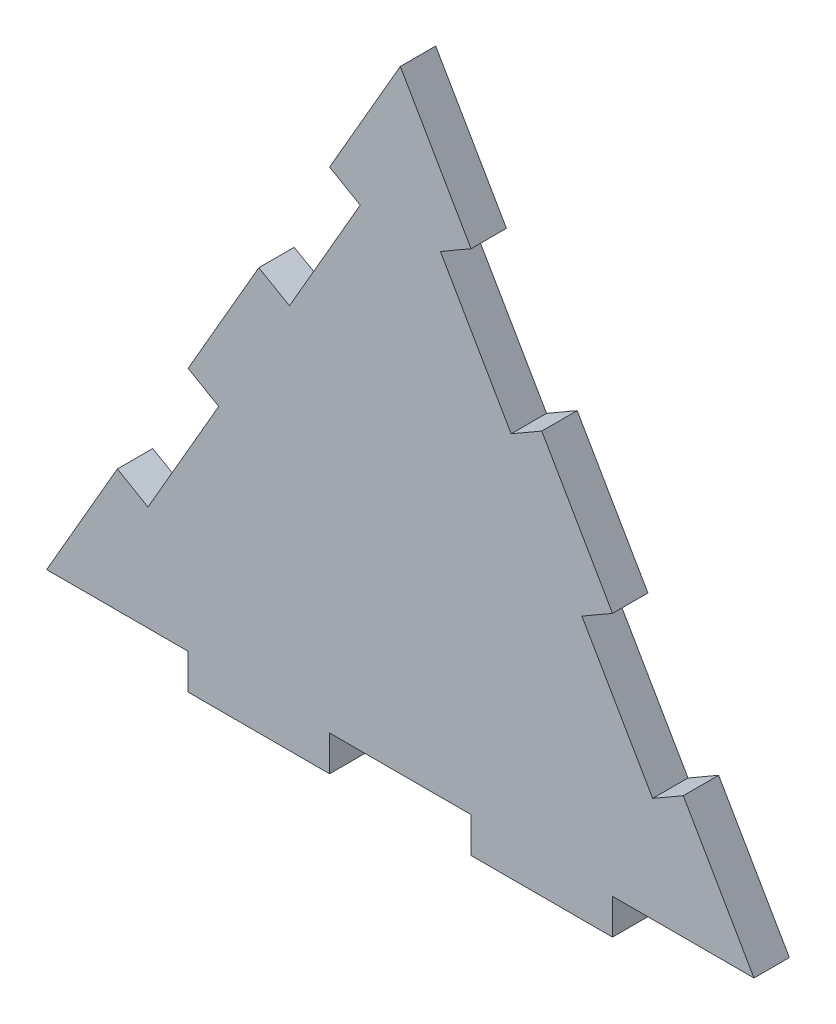
ISO-10303-21;
HEADER;
FILE_DESCRIPTION(('STEP AP214'),'2;1');
FILE_NAME('part.step','',(''),(''),'','','');
FILE_SCHEMA(('AUTOMOTIVE_DESIGN { 1 0 10303 214 1 1 1 1 }'));
ENDSEC;
DATA;
#1=APPLICATION_CONTEXT('core data for automotive mechanical design processes');
#2=APPLICATION_PROTOCOL_DEFINITION('international standard','automotive_design',2000,#1);
#3=PRODUCT_CONTEXT('',#1,'mechanical');
#4=PRODUCT('Part','Part','',(#3));
#5=PRODUCT_RELATED_PRODUCT_CATEGORY('part','',(#4));
#6=PRODUCT_DEFINITION_FORMATION('','',#4);
#7=PRODUCT_DEFINITION_CONTEXT('part definition',#1,'design');
#8=PRODUCT_DEFINITION('design','',#6,#7);
#9=PRODUCT_DEFINITION_SHAPE('','',#8);
#10=(LENGTH_UNIT() NAMED_UNIT(*) SI_UNIT(.MILLI.,.METRE.));
#11=(NAMED_UNIT(*) PLANE_ANGLE_UNIT() SI_UNIT($,.RADIAN.));
#12=(NAMED_UNIT(*) SI_UNIT($,.STERADIAN.) SOLID_ANGLE_UNIT());
#13=UNCERTAINTY_MEASURE_WITH_UNIT(LENGTH_MEASURE(1.E-05),#10,'distance_accuracy_value','');
#14=(GEOMETRIC_REPRESENTATION_CONTEXT(3) GLOBAL_UNCERTAINTY_ASSIGNED_CONTEXT((#13)) GLOBAL_UNIT_ASSIGNED_CONTEXT((#10,
#11,#12)) REPRESENTATION_CONTEXT('',''));
#15=CARTESIAN_POINT('',(0.,0.,0.));
#16=DIRECTION('',(0.,0.,1.));
#17=DIRECTION('',(1.,0.,0.));
#18=AXIS2_PLACEMENT_3D('',#15,#16,#17);
#19=CARTESIAN_POINT('',(-50.,86.6025403784439,5.));
#20=DIRECTION('',(-0.866025403784439,-0.5,0.));
#21=DIRECTION('',(0.5,-0.866025403784439,0.));
#22=AXIS2_PLACEMENT_3D('',#19,#20,#21);
#23=PLANE('',#22);
#24=DIRECTION('',(-0.5,0.866025403784438,0.));
#25=VECTOR('',#24,1.);
#26=CARTESIAN_POINT('',(-50.,86.6025403784439,0.));
#27=LINE('',#26,#25);
#28=CARTESIAN_POINT('',(-20.0000000000001,34.6410161513777,0.));
#29=VERTEX_POINT('',#28);
#30=CARTESIAN_POINT('',(-30.0000000000001,51.9615242270665,0.));
#31=VERTEX_POINT('',#30);
#32=EDGE_CURVE('E247',#29,#31,#27,.T.);
#33=ORIENTED_EDGE('',*,*,#32,.T.);
#34=DIRECTION('',(0.,0.,1.));
#35=VECTOR('',#34,1.);
#36=CARTESIAN_POINT('',(-30.0000000000001,51.9615242270665,0.));
#37=LINE('',#36,#35);
#38=CARTESIAN_POINT('',(-30.0000000000001,51.9615242270665,5.));
#39=VERTEX_POINT('',#38);
#40=EDGE_CURVE('E366',#31,#39,#37,.T.);
#41=ORIENTED_EDGE('',*,*,#40,.T.);
#42=DIRECTION('',(-0.5,0.866025403784438,0.));
#43=VECTOR('',#42,1.);
#44=CARTESIAN_POINT('',(-50.,86.6025403784439,5.));
#45=LINE('',#44,#43);
#46=CARTESIAN_POINT('',(-20.0000000000001,34.6410161513777,5.));
#47=VERTEX_POINT('',#46);
#48=EDGE_CURVE('E266',#47,#39,#45,.T.);
#49=ORIENTED_EDGE('',*,*,#48,.F.);
#50=DIRECTION('',(0.,0.,1.));
#51=VECTOR('',#50,1.);
#52=CARTESIAN_POINT('',(-20.0000000000001,34.6410161513777,0.));
#53=LINE('',#52,#51);
#54=EDGE_CURVE('E351',#29,#47,#53,.T.);
#55=ORIENTED_EDGE('',*,*,#54,.F.);
#56=EDGE_LOOP('',(#33,#41,#49,#55));
#57=FACE_BOUND('',#56,.T.);
#58=ADVANCED_FACE('F35',(#57),#23,.F.);
#59=CARTESIAN_POINT('',(0.,0.,0.));
#60=VERTEX_POINT('',#59);
#61=CARTESIAN_POINT('',(-10.0000000000001,17.3205080756889,0.));
#62=VERTEX_POINT('',#61);
#63=EDGE_CURVE('E242',#60,#62,#27,.T.);
#64=ORIENTED_EDGE('',*,*,#63,.T.);
#65=DIRECTION('',(0.,0.,1.));
#66=VECTOR('',#65,1.);
#67=CARTESIAN_POINT('',(-10.0000000000001,17.3205080756889,0.));
#68=LINE('',#67,#66);
#69=CARTESIAN_POINT('',(-10.0000000000001,17.3205080756889,5.));
#70=VERTEX_POINT('',#69);
#71=EDGE_CURVE('E349',#62,#70,#68,.T.);
#72=ORIENTED_EDGE('',*,*,#71,.T.);
#73=CARTESIAN_POINT('',(0.,0.,5.));
#74=VERTEX_POINT('',#73);
#75=EDGE_CURVE('E268',#74,#70,#45,.T.);
#76=ORIENTED_EDGE('',*,*,#75,.F.);
#77=DIRECTION('',(0.,0.,-1.));
#78=VECTOR('',#77,1.);
#79=CARTESIAN_POINT('',(0.,0.,5.));
#80=LINE('',#79,#78);
#81=EDGE_CURVE('E291',#74,#60,#80,.T.);
#82=ORIENTED_EDGE('',*,*,#81,.T.);
#83=EDGE_LOOP('',(#64,#72,#76,#82));
#84=FACE_BOUND('',#83,.T.);
#85=ADVANCED_FACE('F348',(#84),#23,.F.);
#86=CARTESIAN_POINT('',(-100.,0.,5.));
#87=DIRECTION('',(0.866025403784439,-0.5,0.));
#88=DIRECTION('',(0.5,0.866025403784439,0.));
#89=AXIS2_PLACEMENT_3D('',#86,#87,#88);
#90=PLANE('',#89);
#91=DIRECTION('',(-0.5,-0.866025403784439,0.));
#92=VECTOR('',#91,1.);
#93=CARTESIAN_POINT('',(-100.,0.,0.));
#94=LINE('',#93,#92);
#95=CARTESIAN_POINT('',(-70.,51.9615242270664,0.));
#96=VERTEX_POINT('',#95);
#97=CARTESIAN_POINT('',(-80.,34.6410161513777,0.));
#98=VERTEX_POINT('',#97);
#99=EDGE_CURVE('E241',#96,#98,#94,.T.);
#100=ORIENTED_EDGE('',*,*,#99,.T.);
#101=DIRECTION('',(0.,0.,1.));
#102=VECTOR('',#101,1.);
#103=CARTESIAN_POINT('',(-80.,34.6410161513777,0.));
#104=LINE('',#103,#102);
#105=CARTESIAN_POINT('',(-80.,34.6410161513777,5.));
#106=VERTEX_POINT('',#105);
#107=EDGE_CURVE('E398',#98,#106,#104,.T.);
#108=ORIENTED_EDGE('',*,*,#107,.T.);
#109=DIRECTION('',(-0.5,-0.866025403784439,0.));
#110=VECTOR('',#109,1.);
#111=CARTESIAN_POINT('',(-100.,0.,5.));
#112=LINE('',#111,#110);
#113=CARTESIAN_POINT('',(-70.,51.9615242270664,5.));
#114=VERTEX_POINT('',#113);
#115=EDGE_CURVE('E280',#114,#106,#112,.T.);
#116=ORIENTED_EDGE('',*,*,#115,.F.);
#117=DIRECTION('',(0.,0.,1.));
#118=VECTOR('',#117,1.);
#119=CARTESIAN_POINT('',(-70.,51.9615242270664,0.));
#120=LINE('',#119,#118);
#121=EDGE_CURVE('E393',#96,#114,#120,.T.);
#122=ORIENTED_EDGE('',*,*,#121,.F.);
#123=EDGE_LOOP('',(#100,#108,#116,#122));
#124=FACE_BOUND('',#123,.T.);
#125=ADVANCED_FACE('F447',(#124),#90,.F.);
#126=CARTESIAN_POINT('',(-50.,86.6025403784439,0.));
#127=VERTEX_POINT('',#126);
#128=CARTESIAN_POINT('',(-60.,69.2820323027552,0.));
#129=VERTEX_POINT('',#128);
#130=EDGE_CURVE('E244',#127,#129,#94,.T.);
#131=ORIENTED_EDGE('',*,*,#130,.T.);
#132=DIRECTION('',(0.,0.,1.));
#133=VECTOR('',#132,1.);
#134=CARTESIAN_POINT('',(-60.,69.2820323027552,0.));
#135=LINE('',#134,#133);
#136=CARTESIAN_POINT('',(-60.,69.2820323027552,5.));
#137=VERTEX_POINT('',#136);
#138=EDGE_CURVE('E402',#129,#137,#135,.T.);
#139=ORIENTED_EDGE('',*,*,#138,.T.);
#140=CARTESIAN_POINT('',(-50.,86.6025403784439,5.));
#141=VERTEX_POINT('',#140);
#142=EDGE_CURVE('E281',#141,#137,#112,.T.);
#143=ORIENTED_EDGE('',*,*,#142,.F.);
#144=DIRECTION('',(0.,0.,-1.));
#145=VECTOR('',#144,1.);
#146=CARTESIAN_POINT('',(-50.,86.6025403784439,5.));
#147=LINE('',#146,#145);
#148=EDGE_CURVE('E11',#141,#127,#147,.T.);
#149=ORIENTED_EDGE('',*,*,#148,.T.);
#150=EDGE_LOOP('',(#131,#139,#143,#149));
#151=FACE_BOUND('',#150,.T.);
#152=ADVANCED_FACE('F440',(#151),#90,.F.);
#153=CARTESIAN_POINT('',(0.,0.,5.));
#154=DIRECTION('',(0.,1.,0.));
#155=DIRECTION('',(0.,0.,1.));
#156=AXIS2_PLACEMENT_3D('',#153,#154,#155);
#157=PLANE('',#156);
#158=DIRECTION('',(1.,0.,0.));
#159=VECTOR('',#158,1.);
#160=CARTESIAN_POINT('',(0.,0.,5.));
#161=LINE('',#160,#159);
#162=CARTESIAN_POINT('',(-60.,0.,5.));
#163=VERTEX_POINT('',#162);
#164=CARTESIAN_POINT('',(-40.,0.,5.));
#165=VERTEX_POINT('',#164);
#166=EDGE_CURVE('E287',#163,#165,#161,.T.);
#167=ORIENTED_EDGE('',*,*,#166,.F.);
#168=DIRECTION('',(0.,0.,-1.));
#169=VECTOR('',#168,1.);
#170=CARTESIAN_POINT('',(-60.,0.,5.));
#171=LINE('',#170,#169);
#172=CARTESIAN_POINT('',(-60.,0.,0.));
#173=VERTEX_POINT('',#172);
#174=EDGE_CURVE('E301',#163,#173,#171,.T.);
#175=ORIENTED_EDGE('',*,*,#174,.T.);
#176=DIRECTION('',(1.,0.,0.));
#177=VECTOR('',#176,1.);
#178=CARTESIAN_POINT('',(0.,0.,0.));
#179=LINE('',#178,#177);
#180=CARTESIAN_POINT('',(-40.,0.,0.));
#181=VERTEX_POINT('',#180);
#182=EDGE_CURVE('E256',#173,#181,#179,.T.);
#183=ORIENTED_EDGE('',*,*,#182,.T.);
#184=DIRECTION('',(0.,0.,-1.));
#185=VECTOR('',#184,1.);
#186=CARTESIAN_POINT('',(-40.,0.,5.));
#187=LINE('',#186,#185);
#188=EDGE_CURVE('E333',#165,#181,#187,.T.);
#189=ORIENTED_EDGE('',*,*,#188,.F.);
#190=EDGE_LOOP('',(#167,#175,#183,#189));
#191=FACE_BOUND('',#190,.T.);
#192=ADVANCED_FACE('F438',(#191),#157,.F.);
#193=CARTESIAN_POINT('',(-100.,0.,0.));
#194=VERTEX_POINT('',#193);
#195=CARTESIAN_POINT('',(-80.,0.,0.));
#196=VERTEX_POINT('',#195);
#197=EDGE_CURVE('E240',#194,#196,#179,.T.);
#198=ORIENTED_EDGE('',*,*,#197,.T.);
#199=DIRECTION('',(0.,0.,-1.));
#200=VECTOR('',#199,1.);
#201=CARTESIAN_POINT('',(-80.,0.,5.));
#202=LINE('',#201,#200);
#203=CARTESIAN_POINT('',(-80.,0.,5.));
#204=VERTEX_POINT('',#203);
#205=EDGE_CURVE('E298',#204,#196,#202,.T.);
#206=ORIENTED_EDGE('',*,*,#205,.F.);
#207=CARTESIAN_POINT('',(-100.,0.,5.));
#208=VERTEX_POINT('',#207);
#209=EDGE_CURVE('E288',#208,#204,#161,.T.);
#210=ORIENTED_EDGE('',*,*,#209,.F.);
#211=DIRECTION('',(0.,0.,-1.));
#212=VECTOR('',#211,1.);
#213=CARTESIAN_POINT('',(-100.,0.,5.));
#214=LINE('',#213,#212);
#215=EDGE_CURVE('E43',#208,#194,#214,.T.);
#216=ORIENTED_EDGE('',*,*,#215,.T.);
#217=EDGE_LOOP('',(#198,#206,#210,#216));
#218=FACE_BOUND('',#217,.T.);
#219=ADVANCED_FACE('F297',(#218),#157,.F.);
#220=CARTESIAN_POINT('',(-40.0000000000001,69.2820323027552,5.));
#221=VERTEX_POINT('',#220);
#222=EDGE_CURVE('E263',#221,#141,#45,.T.);
#223=ORIENTED_EDGE('',*,*,#222,.F.);
#224=DIRECTION('',(0.,0.,1.));
#225=VECTOR('',#224,1.);
#226=CARTESIAN_POINT('',(-40.0000000000001,69.2820323027552,0.));
#227=LINE('',#226,#225);
#228=CARTESIAN_POINT('',(-40.0000000000001,69.2820323027552,0.));
#229=VERTEX_POINT('',#228);
#230=EDGE_CURVE('E379',#229,#221,#227,.T.);
#231=ORIENTED_EDGE('',*,*,#230,.F.);
#232=EDGE_CURVE('E249',#229,#127,#27,.T.);
#233=ORIENTED_EDGE('',*,*,#232,.T.);
#234=ORIENTED_EDGE('',*,*,#148,.F.);
#235=EDGE_LOOP('',(#223,#231,#233,#234));
#236=FACE_BOUND('',#235,.T.);
#237=ADVANCED_FACE('F37',(#236),#23,.F.);
#238=CARTESIAN_POINT('',(-89.9999999999999,17.3205080756889,5.));
#239=VERTEX_POINT('',#238);
#240=EDGE_CURVE('E233',#239,#208,#112,.T.);
#241=ORIENTED_EDGE('',*,*,#240,.F.);
#242=DIRECTION('',(0.,0.,1.));
#243=VECTOR('',#242,1.);
#244=CARTESIAN_POINT('',(-89.9999999999999,17.3205080756889,0.));
#245=LINE('',#244,#243);
#246=CARTESIAN_POINT('',(-89.9999999999999,17.3205080756889,0.));
#247=VERTEX_POINT('',#246);
#248=EDGE_CURVE('E218',#247,#239,#245,.T.);
#249=ORIENTED_EDGE('',*,*,#248,.F.);
#250=EDGE_CURVE('E231',#247,#194,#94,.T.);
#251=ORIENTED_EDGE('',*,*,#250,.T.);
#252=ORIENTED_EDGE('',*,*,#215,.F.);
#253=EDGE_LOOP('',(#241,#249,#251,#252));
#254=FACE_BOUND('',#253,.T.);
#255=ADVANCED_FACE('F229',(#254),#90,.F.);
#256=CARTESIAN_POINT('',(-20.,0.,5.));
#257=VERTEX_POINT('',#256);
#258=EDGE_CURVE('E285',#257,#74,#161,.T.);
#259=ORIENTED_EDGE('',*,*,#258,.F.);
#260=DIRECTION('',(0.,0.,-1.));
#261=VECTOR('',#260,1.);
#262=CARTESIAN_POINT('',(-20.,0.,5.));
#263=LINE('',#262,#261);
#264=CARTESIAN_POINT('',(-20.,0.,0.));
#265=VERTEX_POINT('',#264);
#266=EDGE_CURVE('E331',#257,#265,#263,.T.);
#267=ORIENTED_EDGE('',*,*,#266,.T.);
#268=EDGE_CURVE('E252',#265,#60,#179,.T.);
#269=ORIENTED_EDGE('',*,*,#268,.T.);
#270=ORIENTED_EDGE('',*,*,#81,.F.);
#271=EDGE_LOOP('',(#259,#267,#269,#270));
#272=FACE_BOUND('',#271,.T.);
#273=ADVANCED_FACE('F442',(#272),#157,.F.);
#274=CARTESIAN_POINT('',(0.,0.,5.));
#275=DIRECTION('',(0.,0.,-1.));
#276=DIRECTION('',(-1.,0.,0.));
#277=AXIS2_PLACEMENT_3D('',#274,#275,#276);
#278=PLANE('',#277);
#279=ORIENTED_EDGE('',*,*,#48,.T.);
#280=DIRECTION('',(0.866025403784438,0.5,0.));
#281=VECTOR('',#280,1.);
#282=CARTESIAN_POINT('',(-34.3301270189223,49.4615242270664,5.));
#283=LINE('',#282,#281);
#284=CARTESIAN_POINT('',(-34.3301270189223,49.4615242270664,5.));
#285=VERTEX_POINT('',#284);
#286=EDGE_CURVE('E367',#285,#39,#283,.T.);
#287=ORIENTED_EDGE('',*,*,#286,.F.);
#288=DIRECTION('',(0.5,-0.866025403784438,0.));
#289=VECTOR('',#288,1.);
#290=CARTESIAN_POINT('',(-44.3301270189223,66.7820323027552,5.));
#291=LINE('',#290,#289);
#292=CARTESIAN_POINT('',(-44.3301270189223,66.7820323027552,5.));
#293=VERTEX_POINT('',#292);
#294=EDGE_CURVE('E362',#293,#285,#291,.T.);
#295=ORIENTED_EDGE('',*,*,#294,.F.);
#296=DIRECTION('',(-0.866025403784438,-0.500000000000002,0.));
#297=VECTOR('',#296,1.);
#298=CARTESIAN_POINT('',(-40.0000000000001,69.2820323027552,5.));
#299=LINE('',#298,#297);
#300=EDGE_CURVE('E369',#221,#293,#299,.T.);
#301=ORIENTED_EDGE('',*,*,#300,.F.);
#302=ORIENTED_EDGE('',*,*,#222,.T.);
#303=ORIENTED_EDGE('',*,*,#142,.T.);
#304=DIRECTION('',(-0.866025403784438,0.5,0.));
#305=VECTOR('',#304,1.);
#306=CARTESIAN_POINT('',(-60.,69.2820323027552,5.));
#307=LINE('',#306,#305);
#308=CARTESIAN_POINT('',(-55.6698729810777,66.7820323027552,5.));
#309=VERTEX_POINT('',#308);
#310=EDGE_CURVE('E387',#309,#137,#307,.T.);
#311=ORIENTED_EDGE('',*,*,#310,.F.);
#312=DIRECTION('',(0.5,0.866025403784439,0.));
#313=VECTOR('',#312,1.);
#314=CARTESIAN_POINT('',(-55.6698729810777,66.7820323027552,5.));
#315=LINE('',#314,#313);
#316=CARTESIAN_POINT('',(-65.6698729810777,49.4615242270664,5.));
#317=VERTEX_POINT('',#316);
#318=EDGE_CURVE('E397',#317,#309,#315,.T.);
#319=ORIENTED_EDGE('',*,*,#318,.F.);
#320=DIRECTION('',(0.866025403784438,-0.5,0.));
#321=VECTOR('',#320,1.);
#322=CARTESIAN_POINT('',(-65.6698729810777,49.4615242270664,5.));
#323=LINE('',#322,#321);
#324=EDGE_CURVE('E394',#114,#317,#323,.T.);
#325=ORIENTED_EDGE('',*,*,#324,.F.);
#326=ORIENTED_EDGE('',*,*,#115,.T.);
#327=DIRECTION('',(-0.866025403784439,0.5,0.));
#328=VECTOR('',#327,1.);
#329=CARTESIAN_POINT('',(-80.,34.6410161513777,5.));
#330=LINE('',#329,#328);
#331=CARTESIAN_POINT('',(-75.6698729810777,32.1410161513776,5.));
#332=VERTEX_POINT('',#331);
#333=EDGE_CURVE('E225',#332,#106,#330,.T.);
#334=ORIENTED_EDGE('',*,*,#333,.F.);
#335=DIRECTION('',(0.5,0.866025403784438,0.));
#336=VECTOR('',#335,1.);
#337=CARTESIAN_POINT('',(-75.6698729810777,32.1410161513776,5.));
#338=LINE('',#337,#336);
#339=CARTESIAN_POINT('',(-85.6698729810777,14.8205080756889,5.));
#340=VERTEX_POINT('',#339);
#341=EDGE_CURVE('E744',#340,#332,#338,.T.);
#342=ORIENTED_EDGE('',*,*,#341,.F.);
#343=DIRECTION('',(0.866025403784437,-0.500000000000002,0.));
#344=VECTOR('',#343,1.);
#345=CARTESIAN_POINT('',(-85.6698729810777,14.8205080756889,5.));
#346=LINE('',#345,#344);
#347=EDGE_CURVE('E502',#239,#340,#346,.T.);
#348=ORIENTED_EDGE('',*,*,#347,.F.);
#349=ORIENTED_EDGE('',*,*,#240,.T.);
#350=ORIENTED_EDGE('',*,*,#209,.T.);
#351=DIRECTION('',(0.,1.,0.));
#352=VECTOR('',#351,1.);
#353=CARTESIAN_POINT('',(-80.,0.,5.));
#354=LINE('',#353,#352);
#355=CARTESIAN_POINT('',(-80.,-4.99999999997875,5.));
#356=VERTEX_POINT('',#355);
#357=EDGE_CURVE('E312',#356,#204,#354,.T.);
#358=ORIENTED_EDGE('',*,*,#357,.F.);
#359=DIRECTION('',(-1.,0.,0.));
#360=VECTOR('',#359,1.);
#361=CARTESIAN_POINT('',(-60.,-4.99999999997875,5.));
#362=LINE('',#361,#360);
#363=CARTESIAN_POINT('',(-60.,-4.99999999997875,5.));
#364=VERTEX_POINT('',#363);
#365=EDGE_CURVE('E413',#364,#356,#362,.T.);
#366=ORIENTED_EDGE('',*,*,#365,.F.);
#367=DIRECTION('',(0.,-1.,0.));
#368=VECTOR('',#367,1.);
#369=CARTESIAN_POINT('',(-60.,0.,5.));
#370=LINE('',#369,#368);
#371=EDGE_CURVE('E410',#163,#364,#370,.T.);
#372=ORIENTED_EDGE('',*,*,#371,.F.);
#373=ORIENTED_EDGE('',*,*,#166,.T.);
#374=DIRECTION('',(0.,1.,0.));
#375=VECTOR('',#374,1.);
#376=CARTESIAN_POINT('',(-40.,0.,5.));
#377=LINE('',#376,#375);
#378=CARTESIAN_POINT('',(-40.,-4.99999999997875,5.));
#379=VERTEX_POINT('',#378);
#380=EDGE_CURVE('E320',#379,#165,#377,.T.);
#381=ORIENTED_EDGE('',*,*,#380,.F.);
#382=DIRECTION('',(-1.,0.,0.));
#383=VECTOR('',#382,1.);
#384=CARTESIAN_POINT('',(-20.,-4.99999999997875,5.));
#385=LINE('',#384,#383);
#386=CARTESIAN_POINT('',(-20.,-4.99999999997875,5.));
#387=VERTEX_POINT('',#386);
#388=EDGE_CURVE('E316',#387,#379,#385,.T.);
#389=ORIENTED_EDGE('',*,*,#388,.F.);
#390=DIRECTION('',(0.,-1.,0.));
#391=VECTOR('',#390,1.);
#392=CARTESIAN_POINT('',(-20.,0.,5.));
#393=LINE('',#392,#391);
#394=EDGE_CURVE('E313',#257,#387,#393,.T.);
#395=ORIENTED_EDGE('',*,*,#394,.F.);
#396=ORIENTED_EDGE('',*,*,#258,.T.);
#397=ORIENTED_EDGE('',*,*,#75,.T.);
#398=DIRECTION('',(0.866025403784437,0.500000000000002,0.));
#399=VECTOR('',#398,1.);
#400=CARTESIAN_POINT('',(-14.3301270189223,14.8205080756889,5.));
#401=LINE('',#400,#399);
#402=CARTESIAN_POINT('',(-14.3301270189223,14.8205080756889,5.));
#403=VERTEX_POINT('',#402);
#404=EDGE_CURVE('E376',#403,#70,#401,.T.);
#405=ORIENTED_EDGE('',*,*,#404,.F.);
#406=DIRECTION('',(0.500000000000001,-0.866025403784438,0.));
#407=VECTOR('',#406,1.);
#408=CARTESIAN_POINT('',(-24.3301270189223,32.1410161513777,5.));
#409=LINE('',#408,#407);
#410=CARTESIAN_POINT('',(-24.3301270189223,32.1410161513777,5.));
#411=VERTEX_POINT('',#410);
#412=EDGE_CURVE('E492',#411,#403,#409,.T.);
#413=ORIENTED_EDGE('',*,*,#412,.F.);
#414=DIRECTION('',(-0.866025403784439,-0.5,0.));
#415=VECTOR('',#414,1.);
#416=CARTESIAN_POINT('',(-20.0000000000001,34.6410161513777,5.));
#417=LINE('',#416,#415);
#418=EDGE_CURVE('E496',#47,#411,#417,.T.);
#419=ORIENTED_EDGE('',*,*,#418,.F.);
#420=EDGE_LOOP('',(#279,#287,#295,#301,#302,#303,#311,#319,#325,#326,#334,#342,#348,#349,#350,
#358,#366,#372,#373,#381,#389,#395,#396,#397,#405,#413,#419));
#421=FACE_BOUND('',#420,.T.);
#422=ADVANCED_FACE('F426',(#421),#278,.F.);
#423=CARTESIAN_POINT('',(0.,0.,0.));
#424=DIRECTION('',(0.,0.,-1.));
#425=DIRECTION('',(-1.,0.,0.));
#426=AXIS2_PLACEMENT_3D('',#423,#424,#425);
#427=PLANE('',#426);
#428=DIRECTION('',(0.866025403784438,0.5,0.));
#429=VECTOR('',#428,1.);
#430=CARTESIAN_POINT('',(-34.3301270189223,49.4615242270664,0.));
#431=LINE('',#430,#429);
#432=CARTESIAN_POINT('',(-34.3301270189223,49.4615242270664,0.));
#433=VERTEX_POINT('',#432);
#434=EDGE_CURVE('E359',#433,#31,#431,.T.);
#435=ORIENTED_EDGE('',*,*,#434,.T.);
#436=ORIENTED_EDGE('',*,*,#32,.F.);
#437=DIRECTION('',(-0.866025403784439,-0.5,0.));
#438=VECTOR('',#437,1.);
#439=CARTESIAN_POINT('',(-20.0000000000001,34.6410161513777,0.));
#440=LINE('',#439,#438);
#441=CARTESIAN_POINT('',(-24.3301270189223,32.1410161513777,0.));
#442=VERTEX_POINT('',#441);
#443=EDGE_CURVE('E355',#29,#442,#440,.T.);
#444=ORIENTED_EDGE('',*,*,#443,.T.);
#445=DIRECTION('',(0.500000000000001,-0.866025403784438,0.));
#446=VECTOR('',#445,1.);
#447=CARTESIAN_POINT('',(-24.3301270189223,32.1410161513777,0.));
#448=LINE('',#447,#446);
#449=CARTESIAN_POINT('',(-14.3301270189223,14.8205080756889,0.));
#450=VERTEX_POINT('',#449);
#451=EDGE_CURVE('E58',#442,#450,#448,.T.);
#452=ORIENTED_EDGE('',*,*,#451,.T.);
#453=DIRECTION('',(0.866025403784437,0.500000000000002,0.));
#454=VECTOR('',#453,1.);
#455=CARTESIAN_POINT('',(-14.3301270189223,14.8205080756889,0.));
#456=LINE('',#455,#454);
#457=EDGE_CURVE('E346',#450,#62,#456,.T.);
#458=ORIENTED_EDGE('',*,*,#457,.T.);
#459=ORIENTED_EDGE('',*,*,#63,.F.);
#460=ORIENTED_EDGE('',*,*,#268,.F.);
#461=DIRECTION('',(0.,-1.,0.));
#462=VECTOR('',#461,1.);
#463=CARTESIAN_POINT('',(-20.,0.,0.));
#464=LINE('',#463,#462);
#465=CARTESIAN_POINT('',(-20.,-4.99999999997875,0.));
#466=VERTEX_POINT('',#465);
#467=EDGE_CURVE('E305',#265,#466,#464,.T.);
#468=ORIENTED_EDGE('',*,*,#467,.T.);
#469=DIRECTION('',(-1.,0.,0.));
#470=VECTOR('',#469,1.);
#471=CARTESIAN_POINT('',(-20.,-4.99999999997875,0.));
#472=LINE('',#471,#470);
#473=CARTESIAN_POINT('',(-40.,-4.99999999997875,0.));
#474=VERTEX_POINT('',#473);
#475=EDGE_CURVE('E326',#466,#474,#472,.T.);
#476=ORIENTED_EDGE('',*,*,#475,.T.);
#477=DIRECTION('',(0.,1.,0.));
#478=VECTOR('',#477,1.);
#479=CARTESIAN_POINT('',(-40.,0.,0.));
#480=LINE('',#479,#478);
#481=EDGE_CURVE('E317',#474,#181,#480,.T.);
#482=ORIENTED_EDGE('',*,*,#481,.T.);
#483=ORIENTED_EDGE('',*,*,#182,.F.);
#484=DIRECTION('',(0.,-1.,0.));
#485=VECTOR('',#484,1.);
#486=CARTESIAN_POINT('',(-60.,0.,0.));
#487=LINE('',#486,#485);
#488=CARTESIAN_POINT('',(-60.,-4.99999999997875,0.));
#489=VERTEX_POINT('',#488);
#490=EDGE_CURVE('E404',#173,#489,#487,.T.);
#491=ORIENTED_EDGE('',*,*,#490,.T.);
#492=DIRECTION('',(-1.,0.,0.));
#493=VECTOR('',#492,1.);
#494=CARTESIAN_POINT('',(-60.,-4.99999999997875,0.));
#495=LINE('',#494,#493);
#496=CARTESIAN_POINT('',(-80.,-4.99999999997875,0.));
#497=VERTEX_POINT('',#496);
#498=EDGE_CURVE('E420',#489,#497,#495,.T.);
#499=ORIENTED_EDGE('',*,*,#498,.T.);
#500=DIRECTION('',(0.,1.,0.));
#501=VECTOR('',#500,1.);
#502=CARTESIAN_POINT('',(-80.,0.,0.));
#503=LINE('',#502,#501);
#504=EDGE_CURVE('E414',#497,#196,#503,.T.);
#505=ORIENTED_EDGE('',*,*,#504,.T.);
#506=ORIENTED_EDGE('',*,*,#197,.F.);
#507=ORIENTED_EDGE('',*,*,#250,.F.);
#508=DIRECTION('',(0.866025403784437,-0.500000000000002,0.));
#509=VECTOR('',#508,1.);
#510=CARTESIAN_POINT('',(-85.6698729810777,14.8205080756889,0.));
#511=LINE('',#510,#509);
#512=CARTESIAN_POINT('',(-85.6698729810777,14.8205080756889,0.));
#513=VERTEX_POINT('',#512);
#514=EDGE_CURVE('E214',#247,#513,#511,.T.);
#515=ORIENTED_EDGE('',*,*,#514,.T.);
#516=DIRECTION('',(0.5,0.866025403784438,0.));
#517=VECTOR('',#516,1.);
#518=CARTESIAN_POINT('',(-75.6698729810777,32.1410161513776,0.));
#519=LINE('',#518,#517);
#520=CARTESIAN_POINT('',(-75.6698729810777,32.1410161513776,0.));
#521=VERTEX_POINT('',#520);
#522=EDGE_CURVE('E224',#513,#521,#519,.T.);
#523=ORIENTED_EDGE('',*,*,#522,.T.);
#524=DIRECTION('',(-0.866025403784439,0.5,0.));
#525=VECTOR('',#524,1.);
#526=CARTESIAN_POINT('',(-80.,34.6410161513777,0.));
#527=LINE('',#526,#525);
#528=EDGE_CURVE('E234',#521,#98,#527,.T.);
#529=ORIENTED_EDGE('',*,*,#528,.T.);
#530=ORIENTED_EDGE('',*,*,#99,.F.);
#531=DIRECTION('',(0.866025403784438,-0.5,0.));
#532=VECTOR('',#531,1.);
#533=CARTESIAN_POINT('',(-65.6698729810777,49.4615242270664,0.));
#534=LINE('',#533,#532);
#535=CARTESIAN_POINT('',(-65.6698729810777,49.4615242270664,0.));
#536=VERTEX_POINT('',#535);
#537=EDGE_CURVE('E383',#96,#536,#534,.T.);
#538=ORIENTED_EDGE('',*,*,#537,.T.);
#539=DIRECTION('',(0.5,0.866025403784439,0.));
#540=VECTOR('',#539,1.);
#541=CARTESIAN_POINT('',(-55.6698729810777,66.7820323027552,0.));
#542=LINE('',#541,#540);
#543=CARTESIAN_POINT('',(-55.6698729810777,66.7820323027552,0.));
#544=VERTEX_POINT('',#543);
#545=EDGE_CURVE('E386',#536,#544,#542,.T.);
#546=ORIENTED_EDGE('',*,*,#545,.T.);
#547=DIRECTION('',(-0.866025403784438,0.5,0.));
#548=VECTOR('',#547,1.);
#549=CARTESIAN_POINT('',(-60.,69.2820323027552,0.));
#550=LINE('',#549,#548);
#551=EDGE_CURVE('E390',#544,#129,#550,.T.);
#552=ORIENTED_EDGE('',*,*,#551,.T.);
#553=ORIENTED_EDGE('',*,*,#130,.F.);
#554=ORIENTED_EDGE('',*,*,#232,.F.);
#555=DIRECTION('',(-0.866025403784438,-0.500000000000002,0.));
#556=VECTOR('',#555,1.);
#557=CARTESIAN_POINT('',(-40.0000000000001,69.2820323027552,0.));
#558=LINE('',#557,#556);
#559=CARTESIAN_POINT('',(-44.3301270189223,66.7820323027552,0.));
#560=VERTEX_POINT('',#559);
#561=EDGE_CURVE('E361',#229,#560,#558,.T.);
#562=ORIENTED_EDGE('',*,*,#561,.T.);
#563=DIRECTION('',(0.5,-0.866025403784438,0.));
#564=VECTOR('',#563,1.);
#565=CARTESIAN_POINT('',(-44.3301270189223,66.7820323027552,0.));
#566=LINE('',#565,#564);
#567=EDGE_CURVE('E50',#560,#433,#566,.T.);
#568=ORIENTED_EDGE('',*,*,#567,.T.);
#569=EDGE_LOOP('',(#435,#436,#444,#452,#458,#459,#460,#468,#476,#482,#483,#491,#499,#505,#506,
#507,#515,#523,#529,#530,#538,#546,#552,#553,#554,#562,#568));
#570=FACE_BOUND('',#569,.T.);
#571=ADVANCED_FACE('F238',(#570),#427,.T.);
#572=CARTESIAN_POINT('',(-20.,0.,5.));
#573=DIRECTION('',(1.,0.,0.));
#574=DIRECTION('',(0.,0.,-1.));
#575=AXIS2_PLACEMENT_3D('',#572,#573,#574);
#576=PLANE('',#575);
#577=ORIENTED_EDGE('',*,*,#467,.F.);
#578=ORIENTED_EDGE('',*,*,#266,.F.);
#579=ORIENTED_EDGE('',*,*,#394,.T.);
#580=DIRECTION('',(0.,0.,-1.));
#581=VECTOR('',#580,1.);
#582=CARTESIAN_POINT('',(-20.,-4.99999999997875,5.));
#583=LINE('',#582,#581);
#584=EDGE_CURVE('E323',#387,#466,#583,.T.);
#585=ORIENTED_EDGE('',*,*,#584,.T.);
#586=EDGE_LOOP('',(#577,#578,#579,#585));
#587=FACE_BOUND('',#586,.T.);
#588=ADVANCED_FACE('F339',(#587),#576,.T.);
#589=CARTESIAN_POINT('',(-40.,0.,5.));
#590=DIRECTION('',(-1.,0.,0.));
#591=DIRECTION('',(0.,0.,1.));
#592=AXIS2_PLACEMENT_3D('',#589,#590,#591);
#593=PLANE('',#592);
#594=ORIENTED_EDGE('',*,*,#481,.F.);
#595=DIRECTION('',(0.,0.,-1.));
#596=VECTOR('',#595,1.);
#597=CARTESIAN_POINT('',(-40.,-4.99999999997875,5.));
#598=LINE('',#597,#596);
#599=EDGE_CURVE('E336',#379,#474,#598,.T.);
#600=ORIENTED_EDGE('',*,*,#599,.F.);
#601=ORIENTED_EDGE('',*,*,#380,.T.);
#602=ORIENTED_EDGE('',*,*,#188,.T.);
#603=EDGE_LOOP('',(#594,#600,#601,#602));
#604=FACE_BOUND('',#603,.T.);
#605=ADVANCED_FACE('F437',(#604),#593,.T.);
#606=CARTESIAN_POINT('',(-20.,-4.99999999997875,5.));
#607=DIRECTION('',(0.,-1.,0.));
#608=DIRECTION('',(0.,0.,-1.));
#609=AXIS2_PLACEMENT_3D('',#606,#607,#608);
#610=PLANE('',#609);
#611=ORIENTED_EDGE('',*,*,#475,.F.);
#612=ORIENTED_EDGE('',*,*,#584,.F.);
#613=ORIENTED_EDGE('',*,*,#388,.T.);
#614=ORIENTED_EDGE('',*,*,#599,.T.);
#615=EDGE_LOOP('',(#611,#612,#613,#614));
#616=FACE_BOUND('',#615,.T.);
#617=ADVANCED_FACE('F342',(#616),#610,.T.);
#618=CARTESIAN_POINT('',(-60.,0.,5.));
#619=DIRECTION('',(1.,0.,0.));
#620=DIRECTION('',(0.,0.,-1.));
#621=AXIS2_PLACEMENT_3D('',#618,#619,#620);
#622=PLANE('',#621);
#623=ORIENTED_EDGE('',*,*,#490,.F.);
#624=ORIENTED_EDGE('',*,*,#174,.F.);
#625=ORIENTED_EDGE('',*,*,#371,.T.);
#626=DIRECTION('',(0.,0.,-1.));
#627=VECTOR('',#626,1.);
#628=CARTESIAN_POINT('',(-60.,-4.99999999997875,5.));
#629=LINE('',#628,#627);
#630=EDGE_CURVE('E307',#364,#489,#629,.T.);
#631=ORIENTED_EDGE('',*,*,#630,.T.);
#632=EDGE_LOOP('',(#623,#624,#625,#631));
#633=FACE_BOUND('',#632,.T.);
#634=ADVANCED_FACE('F431',(#633),#622,.T.);
#635=CARTESIAN_POINT('',(-80.,0.,5.));
#636=DIRECTION('',(-1.,0.,0.));
#637=DIRECTION('',(0.,0.,1.));
#638=AXIS2_PLACEMENT_3D('',#635,#636,#637);
#639=PLANE('',#638);
#640=ORIENTED_EDGE('',*,*,#504,.F.);
#641=DIRECTION('',(0.,0.,-1.));
#642=VECTOR('',#641,1.);
#643=CARTESIAN_POINT('',(-80.,-4.99999999997875,5.));
#644=LINE('',#643,#642);
#645=EDGE_CURVE('E302',#356,#497,#644,.T.);
#646=ORIENTED_EDGE('',*,*,#645,.F.);
#647=ORIENTED_EDGE('',*,*,#357,.T.);
#648=ORIENTED_EDGE('',*,*,#205,.T.);
#649=EDGE_LOOP('',(#640,#646,#647,#648));
#650=FACE_BOUND('',#649,.T.);
#651=ADVANCED_FACE('F423',(#650),#639,.T.);
#652=CARTESIAN_POINT('',(-60.,-4.99999999997875,5.));
#653=DIRECTION('',(0.,-1.,0.));
#654=DIRECTION('',(0.,0.,-1.));
#655=AXIS2_PLACEMENT_3D('',#652,#653,#654);
#656=PLANE('',#655);
#657=ORIENTED_EDGE('',*,*,#498,.F.);
#658=ORIENTED_EDGE('',*,*,#630,.F.);
#659=ORIENTED_EDGE('',*,*,#365,.T.);
#660=ORIENTED_EDGE('',*,*,#645,.T.);
#661=EDGE_LOOP('',(#657,#658,#659,#660));
#662=FACE_BOUND('',#661,.T.);
#663=ADVANCED_FACE('F428',(#662),#656,.T.);
#664=CARTESIAN_POINT('',(-60.,69.2820323027552,0.));
#665=DIRECTION('',(0.5,0.866025403784439,0.));
#666=DIRECTION('',(-0.866025403784439,0.5,0.));
#667=AXIS2_PLACEMENT_3D('',#664,#665,#666);
#668=PLANE('',#667);
#669=ORIENTED_EDGE('',*,*,#310,.T.);
#670=ORIENTED_EDGE('',*,*,#138,.F.);
#671=ORIENTED_EDGE('',*,*,#551,.F.);
#672=DIRECTION('',(0.,0.,1.));
#673=VECTOR('',#672,1.);
#674=CARTESIAN_POINT('',(-55.6698729810777,66.7820323027552,0.));
#675=LINE('',#674,#673);
#676=EDGE_CURVE('E405',#544,#309,#675,.T.);
#677=ORIENTED_EDGE('',*,*,#676,.T.);
#678=EDGE_LOOP('',(#669,#670,#671,#677));
#679=FACE_BOUND('',#678,.T.);
#680=ADVANCED_FACE('F467',(#679),#668,.F.);
#681=CARTESIAN_POINT('',(-55.6698729810777,66.7820323027552,0.));
#682=DIRECTION('',(0.866025403784439,-0.5,0.));
#683=DIRECTION('',(0.5,0.866025403784439,0.));
#684=AXIS2_PLACEMENT_3D('',#681,#682,#683);
#685=PLANE('',#684);
#686=ORIENTED_EDGE('',*,*,#318,.T.);
#687=ORIENTED_EDGE('',*,*,#676,.F.);
#688=ORIENTED_EDGE('',*,*,#545,.F.);
#689=DIRECTION('',(0.,0.,1.));
#690=VECTOR('',#689,1.);
#691=CARTESIAN_POINT('',(-65.6698729810777,49.4615242270664,0.));
#692=LINE('',#691,#690);
#693=EDGE_CURVE('E407',#536,#317,#692,.T.);
#694=ORIENTED_EDGE('',*,*,#693,.T.);
#695=EDGE_LOOP('',(#686,#687,#688,#694));
#696=FACE_BOUND('',#695,.T.);
#697=ADVANCED_FACE('F471',(#696),#685,.F.);
#698=CARTESIAN_POINT('',(-65.6698729810777,49.4615242270664,0.));
#699=DIRECTION('',(-0.5,-0.866025403784439,0.));
#700=DIRECTION('',(0.866025403784439,-0.5,0.));
#701=AXIS2_PLACEMENT_3D('',#698,#699,#700);
#702=PLANE('',#701);
#703=ORIENTED_EDGE('',*,*,#324,.T.);
#704=ORIENTED_EDGE('',*,*,#693,.F.);
#705=ORIENTED_EDGE('',*,*,#537,.F.);
#706=ORIENTED_EDGE('',*,*,#121,.T.);
#707=EDGE_LOOP('',(#703,#704,#705,#706));
#708=FACE_BOUND('',#707,.T.);
#709=ADVANCED_FACE('F473',(#708),#702,.F.);
#710=CARTESIAN_POINT('',(-80.,34.6410161513777,0.));
#711=DIRECTION('',(0.5,0.866025403784439,0.));
#712=DIRECTION('',(-0.866025403784439,0.5,0.));
#713=AXIS2_PLACEMENT_3D('',#710,#711,#712);
#714=PLANE('',#713);
#715=ORIENTED_EDGE('',*,*,#333,.T.);
#716=ORIENTED_EDGE('',*,*,#107,.F.);
#717=ORIENTED_EDGE('',*,*,#528,.F.);
#718=DIRECTION('',(0.,0.,1.));
#719=VECTOR('',#718,1.);
#720=CARTESIAN_POINT('',(-75.6698729810777,32.1410161513776,0.));
#721=LINE('',#720,#719);
#722=EDGE_CURVE('E484',#521,#332,#721,.T.);
#723=ORIENTED_EDGE('',*,*,#722,.T.);
#724=EDGE_LOOP('',(#715,#716,#717,#723));
#725=FACE_BOUND('',#724,.T.);
#726=ADVANCED_FACE('F536',(#725),#714,.F.);
#727=CARTESIAN_POINT('',(-75.6698729810777,32.1410161513776,0.));
#728=DIRECTION('',(0.866025403784438,-0.5,0.));
#729=DIRECTION('',(0.5,0.866025403784438,0.));
#730=AXIS2_PLACEMENT_3D('',#727,#728,#729);
#731=PLANE('',#730);
#732=ORIENTED_EDGE('',*,*,#341,.T.);
#733=ORIENTED_EDGE('',*,*,#722,.F.);
#734=ORIENTED_EDGE('',*,*,#522,.F.);
#735=DIRECTION('',(0.,0.,1.));
#736=VECTOR('',#735,1.);
#737=CARTESIAN_POINT('',(-85.6698729810777,14.8205080756889,0.));
#738=LINE('',#737,#736);
#739=EDGE_CURVE('E220',#513,#340,#738,.T.);
#740=ORIENTED_EDGE('',*,*,#739,.T.);
#741=EDGE_LOOP('',(#732,#733,#734,#740));
#742=FACE_BOUND('',#741,.T.);
#743=ADVANCED_FACE('F597',(#742),#731,.F.);
#744=CARTESIAN_POINT('',(-85.6698729810777,14.8205080756889,0.));
#745=DIRECTION('',(-0.500000000000002,-0.866025403784437,0.));
#746=DIRECTION('',(0.866025403784437,-0.500000000000002,0.));
#747=AXIS2_PLACEMENT_3D('',#744,#745,#746);
#748=PLANE('',#747);
#749=ORIENTED_EDGE('',*,*,#347,.T.);
#750=ORIENTED_EDGE('',*,*,#739,.F.);
#751=ORIENTED_EDGE('',*,*,#514,.F.);
#752=ORIENTED_EDGE('',*,*,#248,.T.);
#753=EDGE_LOOP('',(#749,#750,#751,#752));
#754=FACE_BOUND('',#753,.T.);
#755=ADVANCED_FACE('F217',(#754),#748,.F.);
#756=CARTESIAN_POINT('',(-14.3301270189223,14.8205080756889,0.));
#757=DIRECTION('',(0.500000000000002,-0.866025403784437,0.));
#758=DIRECTION('',(0.866025403784437,0.500000000000002,0.));
#759=AXIS2_PLACEMENT_3D('',#756,#757,#758);
#760=PLANE('',#759);
#761=ORIENTED_EDGE('',*,*,#404,.T.);
#762=ORIENTED_EDGE('',*,*,#71,.F.);
#763=ORIENTED_EDGE('',*,*,#457,.F.);
#764=DIRECTION('',(0.,0.,1.));
#765=VECTOR('',#764,1.);
#766=CARTESIAN_POINT('',(-14.3301270189223,14.8205080756889,0.));
#767=LINE('',#766,#765);
#768=EDGE_CURVE('E501',#450,#403,#767,.T.);
#769=ORIENTED_EDGE('',*,*,#768,.T.);
#770=EDGE_LOOP('',(#761,#762,#763,#769));
#771=FACE_BOUND('',#770,.T.);
#772=ADVANCED_FACE('F510',(#771),#760,.F.);
#773=CARTESIAN_POINT('',(-24.3301270189223,32.1410161513777,0.));
#774=DIRECTION('',(-0.866025403784438,-0.500000000000001,0.));
#775=DIRECTION('',(0.500000000000001,-0.866025403784438,0.));
#776=AXIS2_PLACEMENT_3D('',#773,#774,#775);
#777=PLANE('',#776);
#778=ORIENTED_EDGE('',*,*,#412,.T.);
#779=ORIENTED_EDGE('',*,*,#768,.F.);
#780=ORIENTED_EDGE('',*,*,#451,.F.);
#781=DIRECTION('',(0.,0.,1.));
#782=VECTOR('',#781,1.);
#783=CARTESIAN_POINT('',(-24.3301270189223,32.1410161513777,0.));
#784=LINE('',#783,#782);
#785=EDGE_CURVE('E353',#442,#411,#784,.T.);
#786=ORIENTED_EDGE('',*,*,#785,.T.);
#787=EDGE_LOOP('',(#778,#779,#780,#786));
#788=FACE_BOUND('',#787,.T.);
#789=ADVANCED_FACE('F503',(#788),#777,.F.);
#790=CARTESIAN_POINT('',(-20.0000000000001,34.6410161513777,0.));
#791=DIRECTION('',(-0.5,0.866025403784439,0.));
#792=DIRECTION('',(-0.866025403784439,-0.5,0.));
#793=AXIS2_PLACEMENT_3D('',#790,#791,#792);
#794=PLANE('',#793);
#795=ORIENTED_EDGE('',*,*,#418,.T.);
#796=ORIENTED_EDGE('',*,*,#785,.F.);
#797=ORIENTED_EDGE('',*,*,#443,.F.);
#798=ORIENTED_EDGE('',*,*,#54,.T.);
#799=EDGE_LOOP('',(#795,#796,#797,#798));
#800=FACE_BOUND('',#799,.T.);
#801=ADVANCED_FACE('F507',(#800),#794,.F.);
#802=CARTESIAN_POINT('',(-34.3301270189223,49.4615242270664,0.));
#803=DIRECTION('',(0.5,-0.866025403784439,0.));
#804=DIRECTION('',(0.866025403784439,0.5,0.));
#805=AXIS2_PLACEMENT_3D('',#802,#803,#804);
#806=PLANE('',#805);
#807=ORIENTED_EDGE('',*,*,#286,.T.);
#808=ORIENTED_EDGE('',*,*,#40,.F.);
#809=ORIENTED_EDGE('',*,*,#434,.F.);
#810=DIRECTION('',(0.,0.,1.));
#811=VECTOR('',#810,1.);
#812=CARTESIAN_POINT('',(-34.3301270189223,49.4615242270664,0.));
#813=LINE('',#812,#811);
#814=EDGE_CURVE('E374',#433,#285,#813,.T.);
#815=ORIENTED_EDGE('',*,*,#814,.T.);
#816=EDGE_LOOP('',(#807,#808,#809,#815));
#817=FACE_BOUND('',#816,.T.);
#818=ADVANCED_FACE('F515',(#817),#806,.F.);
#819=CARTESIAN_POINT('',(-44.3301270189223,66.7820323027552,0.));
#820=DIRECTION('',(-0.866025403784438,-0.5,0.));
#821=DIRECTION('',(0.5,-0.866025403784438,0.));
#822=AXIS2_PLACEMENT_3D('',#819,#820,#821);
#823=PLANE('',#822);
#824=ORIENTED_EDGE('',*,*,#294,.T.);
#825=ORIENTED_EDGE('',*,*,#814,.F.);
#826=ORIENTED_EDGE('',*,*,#567,.F.);
#827=DIRECTION('',(0.,0.,1.));
#828=VECTOR('',#827,1.);
#829=CARTESIAN_POINT('',(-44.3301270189223,66.7820323027552,0.));
#830=LINE('',#829,#828);
#831=EDGE_CURVE('E377',#560,#293,#830,.T.);
#832=ORIENTED_EDGE('',*,*,#831,.T.);
#833=EDGE_LOOP('',(#824,#825,#826,#832));
#834=FACE_BOUND('',#833,.T.);
#835=ADVANCED_FACE('F517',(#834),#823,.F.);
#836=CARTESIAN_POINT('',(-40.0000000000001,69.2820323027552,0.));
#837=DIRECTION('',(-0.500000000000002,0.866025403784438,0.));
#838=DIRECTION('',(-0.866025403784437,-0.500000000000002,0.));
#839=AXIS2_PLACEMENT_3D('',#836,#837,#838);
#840=PLANE('',#839);
#841=ORIENTED_EDGE('',*,*,#300,.T.);
#842=ORIENTED_EDGE('',*,*,#831,.F.);
#843=ORIENTED_EDGE('',*,*,#561,.F.);
#844=ORIENTED_EDGE('',*,*,#230,.T.);
#845=EDGE_LOOP('',(#841,#842,#843,#844));
#846=FACE_BOUND('',#845,.T.);
#847=ADVANCED_FACE('F519',(#846),#840,.F.);
#848=CLOSED_SHELL('',(#58,#85,#125,#152,#192,#219,#237,#255,#273,#422,#571,#588,#605,#617,#634,
#651,#663,#680,#697,#709,#726,#743,#755,#772,#789,#801,#818,#835,#847));
#849=MANIFOLD_SOLID_BREP('B2',#848);
#850=ADVANCED_BREP_SHAPE_REPRESENTATION('',(#18,#849),#14);
#851=SHAPE_DEFINITION_REPRESENTATION(#9,#850);
ENDSEC;
END-ISO-10303-21;
